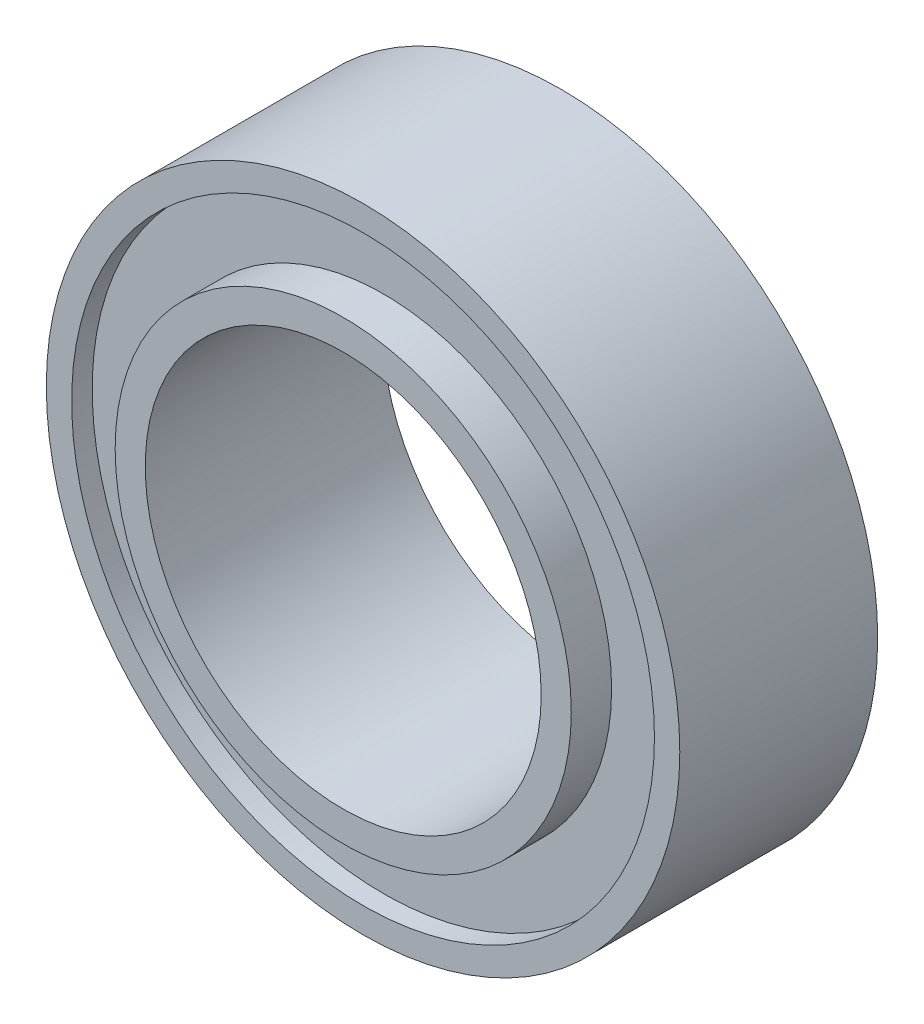
ISO-10303-21;
HEADER;
FILE_DESCRIPTION(('STEP AP214'),'2;1');
FILE_NAME('part.step','',(''),(''),'','','');
FILE_SCHEMA(('AUTOMOTIVE_DESIGN { 1 0 10303 214 1 1 1 1 }'));
ENDSEC;
DATA;
#1=APPLICATION_CONTEXT('core data for automotive mechanical design processes');
#2=APPLICATION_PROTOCOL_DEFINITION('international standard','automotive_design',2000,#1);
#3=PRODUCT_CONTEXT('',#1,'mechanical');
#4=PRODUCT('Part','Part','',(#3));
#5=PRODUCT_RELATED_PRODUCT_CATEGORY('part','',(#4));
#6=PRODUCT_DEFINITION_FORMATION('','',#4);
#7=PRODUCT_DEFINITION_CONTEXT('part definition',#1,'design');
#8=PRODUCT_DEFINITION('design','',#6,#7);
#9=PRODUCT_DEFINITION_SHAPE('','',#8);
#10=(LENGTH_UNIT() NAMED_UNIT(*) SI_UNIT(.MILLI.,.METRE.));
#11=(NAMED_UNIT(*) PLANE_ANGLE_UNIT() SI_UNIT($,.RADIAN.));
#12=(NAMED_UNIT(*) SI_UNIT($,.STERADIAN.) SOLID_ANGLE_UNIT());
#13=UNCERTAINTY_MEASURE_WITH_UNIT(LENGTH_MEASURE(1.E-05),#10,'distance_accuracy_value','');
#14=(GEOMETRIC_REPRESENTATION_CONTEXT(3) GLOBAL_UNCERTAINTY_ASSIGNED_CONTEXT((#13)) GLOBAL_UNIT_ASSIGNED_CONTEXT((#10,
#11,#12)) REPRESENTATION_CONTEXT('',''));
#15=CARTESIAN_POINT('',(0.,0.,0.));
#16=DIRECTION('',(0.,0.,1.));
#17=DIRECTION('',(1.,0.,0.));
#18=AXIS2_PLACEMENT_3D('',#15,#16,#17);
#19=CARTESIAN_POINT('',(0.,0.,3.96748));
#20=DIRECTION('',(0.,0.,-1.));
#21=DIRECTION('',(-1.,0.,0.));
#22=AXIS2_PLACEMENT_3D('',#19,#20,#21);
#23=CYLINDRICAL_SURFACE('',#22,5.842);
#24=CARTESIAN_POINT('',(0.,0.,0.));
#25=DIRECTION('',(0.,0.,1.));
#26=DIRECTION('',(1.,0.,0.));
#27=AXIS2_PLACEMENT_3D('',#24,#25,#26);
#28=CIRCLE('',#27,5.842);
#29=CARTESIAN_POINT('',(5.842,0.,0.));
#30=VERTEX_POINT('',#29);
#31=EDGE_CURVE('E54',#30,#30,#28,.T.);
#32=ORIENTED_EDGE('',*,*,#31,.F.);
#33=EDGE_LOOP('',(#32));
#34=FACE_BOUND('',#33,.T.);
#35=CARTESIAN_POINT('',(0.,0.,0.41148));
#36=DIRECTION('',(0.,0.,1.));
#37=DIRECTION('',(1.,0.,0.));
#38=AXIS2_PLACEMENT_3D('',#35,#36,#37);
#39=CIRCLE('',#38,5.842);
#40=CARTESIAN_POINT('',(5.842,0.,0.41148));
#41=VERTEX_POINT('',#40);
#42=EDGE_CURVE('E87',#41,#41,#39,.T.);
#43=ORIENTED_EDGE('',*,*,#42,.T.);
#44=EDGE_LOOP('',(#43));
#45=FACE_BOUND('',#44,.T.);
#46=ADVANCED_FACE('F34',(#34,#45),#23,.F.);
#47=CARTESIAN_POINT('',(0.,0.,3.556));
#48=DIRECTION('',(0.,0.,1.));
#49=DIRECTION('',(1.,0.,0.));
#50=AXIS2_PLACEMENT_3D('',#47,#48,#49);
#51=CIRCLE('',#50,5.842);
#52=CARTESIAN_POINT('',(5.842,0.,3.556));
#53=VERTEX_POINT('',#52);
#54=EDGE_CURVE('E10',#53,#53,#51,.T.);
#55=ORIENTED_EDGE('',*,*,#54,.F.);
#56=EDGE_LOOP('',(#55));
#57=FACE_BOUND('',#56,.T.);
#58=CARTESIAN_POINT('',(0.,0.,3.96748));
#59=DIRECTION('',(0.,0.,1.));
#60=DIRECTION('',(1.,0.,0.));
#61=AXIS2_PLACEMENT_3D('',#58,#59,#60);
#62=CIRCLE('',#61,5.842);
#63=CARTESIAN_POINT('',(5.842,0.,3.96748));
#64=VERTEX_POINT('',#63);
#65=EDGE_CURVE('E45',#64,#64,#62,.T.);
#66=ORIENTED_EDGE('',*,*,#65,.T.);
#67=EDGE_LOOP('',(#66));
#68=FACE_BOUND('',#67,.T.);
#69=ADVANCED_FACE('F36',(#57,#68),#23,.F.);
#70=CARTESIAN_POINT('',(0.,0.,3.96748));
#71=DIRECTION('',(0.,0.,-1.));
#72=DIRECTION('',(-1.,0.,0.));
#73=AXIS2_PLACEMENT_3D('',#70,#71,#72);
#74=CYLINDRICAL_SURFACE('',#73,6.35);
#75=CARTESIAN_POINT('',(0.,0.,3.96748));
#76=DIRECTION('',(0.,0.,1.));
#77=DIRECTION('',(1.,0.,0.));
#78=AXIS2_PLACEMENT_3D('',#75,#76,#77);
#79=CIRCLE('',#78,6.35);
#80=CARTESIAN_POINT('',(6.35,0.,3.96748));
#81=VERTEX_POINT('',#80);
#82=EDGE_CURVE('E41',#81,#81,#79,.T.);
#83=ORIENTED_EDGE('',*,*,#82,.F.);
#84=EDGE_LOOP('',(#83));
#85=FACE_BOUND('',#84,.T.);
#86=CARTESIAN_POINT('',(0.,0.,0.));
#87=DIRECTION('',(0.,0.,1.));
#88=DIRECTION('',(1.,0.,0.));
#89=AXIS2_PLACEMENT_3D('',#86,#87,#88);
#90=CIRCLE('',#89,6.35);
#91=CARTESIAN_POINT('',(6.35,0.,0.));
#92=VERTEX_POINT('',#91);
#93=EDGE_CURVE('E50',#92,#92,#90,.T.);
#94=ORIENTED_EDGE('',*,*,#93,.T.);
#95=EDGE_LOOP('',(#94));
#96=FACE_BOUND('',#95,.T.);
#97=ADVANCED_FACE('F60',(#85,#96),#74,.T.);
#98=CARTESIAN_POINT('',(0.,-14.1114213562373,3.96748));
#99=DIRECTION('',(0.,0.,1.));
#100=DIRECTION('',(1.,0.,0.));
#101=AXIS2_PLACEMENT_3D('',#98,#99,#100);
#102=PLANE('',#101);
#103=ORIENTED_EDGE('',*,*,#65,.F.);
#104=EDGE_LOOP('',(#103));
#105=FACE_BOUND('',#104,.T.);
#106=ORIENTED_EDGE('',*,*,#82,.T.);
#107=EDGE_LOOP('',(#106));
#108=FACE_BOUND('',#107,.T.);
#109=ADVANCED_FACE('F65',(#105,#108),#102,.T.);
#110=CARTESIAN_POINT('',(0.,-14.1114213562373,0.));
#111=DIRECTION('',(0.,0.,1.));
#112=DIRECTION('',(1.,0.,0.));
#113=AXIS2_PLACEMENT_3D('',#110,#111,#112);
#114=PLANE('',#113);
#115=ORIENTED_EDGE('',*,*,#31,.T.);
#116=EDGE_LOOP('',(#115));
#117=FACE_BOUND('',#116,.T.);
#118=ORIENTED_EDGE('',*,*,#93,.F.);
#119=EDGE_LOOP('',(#118));
#120=FACE_BOUND('',#119,.T.);
#121=ADVANCED_FACE('F62',(#117,#120),#114,.F.);
#122=CARTESIAN_POINT('',(0.,-14.1114213562373,3.556));
#123=DIRECTION('',(0.,0.,1.));
#124=DIRECTION('',(1.,0.,0.));
#125=AXIS2_PLACEMENT_3D('',#122,#123,#124);
#126=PLANE('',#125);
#127=CARTESIAN_POINT('',(0.,0.,3.556));
#128=DIRECTION('',(0.,0.,1.));
#129=DIRECTION('',(1.,0.,0.));
#130=AXIS2_PLACEMENT_3D('',#127,#128,#129);
#131=CIRCLE('',#130,4.572);
#132=CARTESIAN_POINT('',(4.572,0.,3.556));
#133=VERTEX_POINT('',#132);
#134=EDGE_CURVE('E56',#133,#133,#131,.T.);
#135=ORIENTED_EDGE('',*,*,#134,.F.);
#136=EDGE_LOOP('',(#135));
#137=FACE_BOUND('',#136,.T.);
#138=ORIENTED_EDGE('',*,*,#54,.T.);
#139=EDGE_LOOP('',(#138));
#140=FACE_BOUND('',#139,.T.);
#141=ADVANCED_FACE('F64',(#137,#140),#126,.T.);
#142=CARTESIAN_POINT('',(0.,-14.1114213562373,0.41148));
#143=DIRECTION('',(0.,0.,1.));
#144=DIRECTION('',(1.,0.,0.));
#145=AXIS2_PLACEMENT_3D('',#142,#143,#144);
#146=PLANE('',#145);
#147=CARTESIAN_POINT('',(0.,0.,0.41148));
#148=DIRECTION('',(0.,0.,1.));
#149=DIRECTION('',(1.,0.,0.));
#150=AXIS2_PLACEMENT_3D('',#147,#148,#149);
#151=CIRCLE('',#150,4.572);
#152=CARTESIAN_POINT('',(4.572,0.,0.41148));
#153=VERTEX_POINT('',#152);
#154=EDGE_CURVE('E89',#153,#153,#151,.T.);
#155=ORIENTED_EDGE('',*,*,#154,.T.);
#156=EDGE_LOOP('',(#155));
#157=FACE_BOUND('',#156,.T.);
#158=ORIENTED_EDGE('',*,*,#42,.F.);
#159=EDGE_LOOP('',(#158));
#160=FACE_BOUND('',#159,.T.);
#161=ADVANCED_FACE('F72',(#157,#160),#146,.F.);
#162=CARTESIAN_POINT('',(0.,0.,-0.39751));
#163=DIRECTION('',(0.,0.,1.));
#164=DIRECTION('',(1.,0.,0.));
#165=AXIS2_PLACEMENT_3D('',#162,#163,#164);
#166=CYLINDRICAL_SURFACE('',#165,4.572);
#167=CARTESIAN_POINT('',(0.,0.,-0.39751));
#168=DIRECTION('',(0.,0.,1.));
#169=DIRECTION('',(1.,0.,0.));
#170=AXIS2_PLACEMENT_3D('',#167,#168,#169);
#171=CIRCLE('',#170,4.572);
#172=CARTESIAN_POINT('',(4.572,0.,-0.39751));
#173=VERTEX_POINT('',#172);
#174=EDGE_CURVE('E93',#173,#173,#171,.T.);
#175=CARTESIAN_POINT('',(4.572,0.,-0.39751));
#176=CARTESIAN_POINT('',(4.572,0.,-0.389083020833333));
#177=CARTESIAN_POINT('',(4.572,0.,-0.380656041666667));
#178=CARTESIAN_POINT('',(4.572,0.,-0.363802083333333));
#179=CARTESIAN_POINT('',(4.572,0.,-0.355375104166667));
#180=CARTESIAN_POINT('',(4.572,0.,-0.338521145833333));
#181=CARTESIAN_POINT('',(4.572,0.,-0.330094166666667));
#182=CARTESIAN_POINT('',(4.572,0.,-0.313240208333333));
#183=CARTESIAN_POINT('',(4.572,0.,-0.304813229166667));
#184=CARTESIAN_POINT('',(4.572,0.,-0.287959270833333));
#185=CARTESIAN_POINT('',(4.572,0.,-0.279532291666667));
#186=CARTESIAN_POINT('',(4.572,0.,-0.262678333333333));
#187=CARTESIAN_POINT('',(4.572,0.,-0.254251354166667));
#188=CARTESIAN_POINT('',(4.572,0.,-0.237397395833333));
#189=CARTESIAN_POINT('',(4.572,0.,-0.228970416666667));
#190=CARTESIAN_POINT('',(4.572,0.,-0.212116458333333));
#191=CARTESIAN_POINT('',(4.572,0.,-0.203689479166667));
#192=CARTESIAN_POINT('',(4.572,0.,-0.186835520833333));
#193=CARTESIAN_POINT('',(4.572,0.,-0.178408541666667));
#194=CARTESIAN_POINT('',(4.572,0.,-0.161554583333333));
#195=CARTESIAN_POINT('',(4.572,0.,-0.153127604166667));
#196=CARTESIAN_POINT('',(4.572,0.,-0.136273645833333));
#197=CARTESIAN_POINT('',(4.572,0.,-0.127846666666667));
#198=CARTESIAN_POINT('',(4.572,0.,-0.110992708333333));
#199=CARTESIAN_POINT('',(4.572,0.,-0.102565729166667));
#200=CARTESIAN_POINT('',(4.572,0.,-0.0857117708333334));
#201=CARTESIAN_POINT('',(4.572,0.,-0.0772847916666667));
#202=CARTESIAN_POINT('',(4.572,0.,-0.0604308333333334));
#203=CARTESIAN_POINT('',(4.572,0.,-0.0520038541666667));
#204=CARTESIAN_POINT('',(4.572,0.,-0.0351498958333334));
#205=CARTESIAN_POINT('',(4.572,0.,-0.0267229166666667));
#206=CARTESIAN_POINT('',(4.572,0.,-0.00986895833333341));
#207=CARTESIAN_POINT('',(4.572,0.,-0.00144197916666674));
#208=CARTESIAN_POINT('',(4.572,0.,0.0154119791666666));
#209=CARTESIAN_POINT('',(4.572,0.,0.0238389583333333));
#210=CARTESIAN_POINT('',(4.572,0.,0.0406929166666666));
#211=CARTESIAN_POINT('',(4.572,0.,0.0491198958333333));
#212=CARTESIAN_POINT('',(4.572,0.,0.0659738541666666));
#213=CARTESIAN_POINT('',(4.572,0.,0.0744008333333333));
#214=CARTESIAN_POINT('',(4.572,0.,0.0912547916666666));
#215=CARTESIAN_POINT('',(4.572,0.,0.0996817708333333));
#216=CARTESIAN_POINT('',(4.572,0.,0.116535729166667));
#217=CARTESIAN_POINT('',(4.572,0.,0.124962708333333));
#218=CARTESIAN_POINT('',(4.572,0.,0.141816666666667));
#219=CARTESIAN_POINT('',(4.572,0.,0.150243645833333));
#220=CARTESIAN_POINT('',(4.572,0.,0.167097604166667));
#221=CARTESIAN_POINT('',(4.572,0.,0.175524583333333));
#222=CARTESIAN_POINT('',(4.572,0.,0.192378541666667));
#223=CARTESIAN_POINT('',(4.572,0.,0.200805520833333));
#224=CARTESIAN_POINT('',(4.572,0.,0.217659479166667));
#225=CARTESIAN_POINT('',(4.572,0.,0.226086458333333));
#226=CARTESIAN_POINT('',(4.572,0.,0.242940416666667));
#227=CARTESIAN_POINT('',(4.572,0.,0.251367395833333));
#228=CARTESIAN_POINT('',(4.572,0.,0.268221354166667));
#229=CARTESIAN_POINT('',(4.572,0.,0.276648333333333));
#230=CARTESIAN_POINT('',(4.572,0.,0.293502291666667));
#231=CARTESIAN_POINT('',(4.572,0.,0.301929270833333));
#232=CARTESIAN_POINT('',(4.572,0.,0.318783229166667));
#233=CARTESIAN_POINT('',(4.572,0.,0.327210208333333));
#234=CARTESIAN_POINT('',(4.572,0.,0.344064166666667));
#235=CARTESIAN_POINT('',(4.572,0.,0.352491145833333));
#236=CARTESIAN_POINT('',(4.572,0.,0.369345104166667));
#237=CARTESIAN_POINT('',(4.572,0.,0.377772083333333));
#238=CARTESIAN_POINT('',(4.572,0.,0.394626041666667));
#239=CARTESIAN_POINT('',(4.572,0.,0.403053020833333));
#240=CARTESIAN_POINT('',(4.572,0.,0.41148));
#241=B_SPLINE_CURVE_WITH_KNOTS('',3,(#175,#176,#177,#178,#179,#180,#181,#182,#183,#184,#185,
#186,#187,#188,#189,#190,#191,#192,#193,#194,#195,#196,#197,#198,#199,#200,#201,#202,#203,#204,
#205,#206,#207,#208,#209,#210,#211,#212,#213,#214,#215,#216,#217,#218,#219,#220,#221,#222,#223,
#224,#225,#226,#227,#228,#229,#230,#231,#232,#233,#234,#235,#236,#237,#238,#239,#240),
.UNSPECIFIED.,.F.,.F.,(4,2,2,2,2,2,2,2,2,2,2,2,2,2,2,2,2,2,2,2,2,2,2,2,2,2,2,2,2,2,2,2,4),(0.,
0.0252809375,0.050561875,0.0758428125,0.10112375,0.1264046875,0.151685625,0.1769665625,
0.2022475,0.2275284375,0.252809375,0.2780903125,0.30337125,0.3286521875,0.353933125,
0.3792140625,0.404495,0.4297759375,0.455056875,0.4803378125,0.50561875,0.5308996875,0.556180625,
0.5814615625,0.6067425,0.6320234375,0.657304375,0.6825853125,0.70786625,0.7331471875,
0.758428125,0.7837090625,0.80899),.UNSPECIFIED.);
#242=EDGE_CURVE('BSEAM121',#173,#153,#241,.T.);
#243=ORIENTED_EDGE('',*,*,#174,.T.);
#244=ORIENTED_EDGE('',*,*,#154,.F.);
#245=ORIENTED_EDGE('',*,*,#242,.T.);
#246=ORIENTED_EDGE('',*,*,#242,.F.);
#247=EDGE_LOOP('',(#243,#245,#244,#246));
#248=FACE_BOUND('',#247,.T.);
#249=ADVANCED_FACE('F121',(#248),#166,.T.);
#250=CARTESIAN_POINT('',(0.,0.,-0.39751));
#251=DIRECTION('',(0.,0.,1.));
#252=DIRECTION('',(1.,0.,0.));
#253=AXIS2_PLACEMENT_3D('',#250,#251,#252);
#254=CYLINDRICAL_SURFACE('',#253,3.96875);
#255=CARTESIAN_POINT('',(0.,0.,-0.39751));
#256=DIRECTION('',(0.,0.,1.));
#257=DIRECTION('',(1.,0.,0.));
#258=AXIS2_PLACEMENT_3D('',#255,#256,#257);
#259=CIRCLE('',#258,3.96875);
#260=CARTESIAN_POINT('',(3.96875,0.,-0.39751));
#261=VERTEX_POINT('',#260);
#262=EDGE_CURVE('E98',#261,#261,#259,.T.);
#263=CARTESIAN_POINT('',(0.,0.,4.36499));
#264=DIRECTION('',(0.,0.,1.));
#265=DIRECTION('',(1.,0.,0.));
#266=AXIS2_PLACEMENT_3D('',#263,#264,#265);
#267=CIRCLE('',#266,3.96875);
#268=CARTESIAN_POINT('',(3.96875,0.,4.36499));
#269=VERTEX_POINT('',#268);
#270=EDGE_CURVE('E104',#269,#269,#267,.T.);
#271=CARTESIAN_POINT('',(3.96875,0.,-0.39751));
#272=CARTESIAN_POINT('',(3.96875,0.,-0.347900625));
#273=CARTESIAN_POINT('',(3.96875,0.,-0.29829125));
#274=CARTESIAN_POINT('',(3.96875,0.,-0.1990725));
#275=CARTESIAN_POINT('',(3.96875,0.,-0.149463125));
#276=CARTESIAN_POINT('',(3.96875,0.,-0.050244375));
#277=CARTESIAN_POINT('',(3.96875,0.,-0.000634999999999963));
#278=CARTESIAN_POINT('',(3.96875,0.,0.09858375));
#279=CARTESIAN_POINT('',(3.96875,0.,0.148193125));
#280=CARTESIAN_POINT('',(3.96875,0.,0.247411875));
#281=CARTESIAN_POINT('',(3.96875,0.,0.29702125));
#282=CARTESIAN_POINT('',(3.96875,0.,0.39624));
#283=CARTESIAN_POINT('',(3.96875,0.,0.445849375));
#284=CARTESIAN_POINT('',(3.96875,0.,0.545068125));
#285=CARTESIAN_POINT('',(3.96875,0.,0.5946775));
#286=CARTESIAN_POINT('',(3.96875,0.,0.69389625));
#287=CARTESIAN_POINT('',(3.96875,0.,0.743505625));
#288=CARTESIAN_POINT('',(3.96875,0.,0.842724375));
#289=CARTESIAN_POINT('',(3.96875,0.,0.89233375));
#290=CARTESIAN_POINT('',(3.96875,0.,0.9915525));
#291=CARTESIAN_POINT('',(3.96875,0.,1.041161875));
#292=CARTESIAN_POINT('',(3.96875,0.,1.140380625));
#293=CARTESIAN_POINT('',(3.96875,0.,1.18999));
#294=CARTESIAN_POINT('',(3.96875,0.,1.28920875));
#295=CARTESIAN_POINT('',(3.96875,0.,1.338818125));
#296=CARTESIAN_POINT('',(3.96875,0.,1.438036875));
#297=CARTESIAN_POINT('',(3.96875,0.,1.48764625));
#298=CARTESIAN_POINT('',(3.96875,0.,1.586865));
#299=CARTESIAN_POINT('',(3.96875,0.,1.636474375));
#300=CARTESIAN_POINT('',(3.96875,0.,1.735693125));
#301=CARTESIAN_POINT('',(3.96875,0.,1.7853025));
#302=CARTESIAN_POINT('',(3.96875,0.,1.88452125));
#303=CARTESIAN_POINT('',(3.96875,0.,1.934130625));
#304=CARTESIAN_POINT('',(3.96875,0.,2.033349375));
#305=CARTESIAN_POINT('',(3.96875,0.,2.08295875));
#306=CARTESIAN_POINT('',(3.96875,0.,2.1821775));
#307=CARTESIAN_POINT('',(3.96875,0.,2.231786875));
#308=CARTESIAN_POINT('',(3.96875,0.,2.331005625));
#309=CARTESIAN_POINT('',(3.96875,0.,2.380615));
#310=CARTESIAN_POINT('',(3.96875,0.,2.47983375));
#311=CARTESIAN_POINT('',(3.96875,0.,2.529443125));
#312=CARTESIAN_POINT('',(3.96875,0.,2.628661875));
#313=CARTESIAN_POINT('',(3.96875,0.,2.67827125));
#314=CARTESIAN_POINT('',(3.96875,0.,2.77749));
#315=CARTESIAN_POINT('',(3.96875,0.,2.827099375));
#316=CARTESIAN_POINT('',(3.96875,0.,2.926318125));
#317=CARTESIAN_POINT('',(3.96875,0.,2.9759275));
#318=CARTESIAN_POINT('',(3.96875,0.,3.07514625));
#319=CARTESIAN_POINT('',(3.96875,0.,3.124755625));
#320=CARTESIAN_POINT('',(3.96875,0.,3.223974375));
#321=CARTESIAN_POINT('',(3.96875,0.,3.27358375));
#322=CARTESIAN_POINT('',(3.96875,0.,3.3728025));
#323=CARTESIAN_POINT('',(3.96875,0.,3.422411875));
#324=CARTESIAN_POINT('',(3.96875,0.,3.521630625));
#325=CARTESIAN_POINT('',(3.96875,0.,3.57124));
#326=CARTESIAN_POINT('',(3.96875,0.,3.67045875));
#327=CARTESIAN_POINT('',(3.96875,0.,3.720068125));
#328=CARTESIAN_POINT('',(3.96875,0.,3.819286875));
#329=CARTESIAN_POINT('',(3.96875,0.,3.86889625));
#330=CARTESIAN_POINT('',(3.96875,0.,3.968115));
#331=CARTESIAN_POINT('',(3.96875,0.,4.017724375));
#332=CARTESIAN_POINT('',(3.96875,0.,4.116943125));
#333=CARTESIAN_POINT('',(3.96875,0.,4.1665525));
#334=CARTESIAN_POINT('',(3.96875,0.,4.26577125));
#335=CARTESIAN_POINT('',(3.96875,0.,4.315380625));
#336=CARTESIAN_POINT('',(3.96875,0.,4.36499));
#337=B_SPLINE_CURVE_WITH_KNOTS('',3,(#271,#272,#273,#274,#275,#276,#277,#278,#279,#280,#281,
#282,#283,#284,#285,#286,#287,#288,#289,#290,#291,#292,#293,#294,#295,#296,#297,#298,#299,#300,
#301,#302,#303,#304,#305,#306,#307,#308,#309,#310,#311,#312,#313,#314,#315,#316,#317,#318,#319,
#320,#321,#322,#323,#324,#325,#326,#327,#328,#329,#330,#331,#332,#333,#334,#335,#336),
.UNSPECIFIED.,.F.,.F.,(4,2,2,2,2,2,2,2,2,2,2,2,2,2,2,2,2,2,2,2,2,2,2,2,2,2,2,2,2,2,2,2,4),(0.,
0.148828125,0.29765625,0.446484375,0.5953125,0.744140625,0.89296875,1.041796875,1.190625,
1.339453125,1.48828125,1.637109375,1.7859375,1.934765625,2.08359375,2.232421875,2.38125,
2.530078125,2.67890625,2.827734375,2.9765625,3.125390625,3.27421875,3.423046875,3.571875,
3.720703125,3.86953125,4.018359375,4.1671875,4.316015625,4.46484375,4.613671875,4.7625),.UNSPECIFIED.);
#338=EDGE_CURVE('BSEAM108',#261,#269,#337,.T.);
#339=ORIENTED_EDGE('',*,*,#262,.F.);
#340=ORIENTED_EDGE('',*,*,#270,.T.);
#341=ORIENTED_EDGE('',*,*,#338,.T.);
#342=ORIENTED_EDGE('',*,*,#338,.F.);
#343=EDGE_LOOP('',(#339,#341,#340,#342));
#344=FACE_BOUND('',#343,.T.);
#345=ADVANCED_FACE('F108',(#344),#254,.F.);
#346=CARTESIAN_POINT('',(0.,0.,4.36499));
#347=DIRECTION('',(0.,0.,1.));
#348=DIRECTION('',(1.,0.,0.));
#349=AXIS2_PLACEMENT_3D('',#346,#347,#348);
#350=CIRCLE('',#349,4.572);
#351=CARTESIAN_POINT('',(4.572,0.,4.36499));
#352=VERTEX_POINT('',#351);
#353=EDGE_CURVE('E101',#352,#352,#350,.T.);
#354=CARTESIAN_POINT('',(4.572,0.,3.556));
#355=CARTESIAN_POINT('',(4.572,0.,3.56442697916667));
#356=CARTESIAN_POINT('',(4.572,0.,3.57285395833333));
#357=CARTESIAN_POINT('',(4.572,0.,3.58970791666667));
#358=CARTESIAN_POINT('',(4.572,0.,3.59813489583333));
#359=CARTESIAN_POINT('',(4.572,0.,3.61498885416667));
#360=CARTESIAN_POINT('',(4.572,0.,3.62341583333333));
#361=CARTESIAN_POINT('',(4.572,0.,3.64026979166667));
#362=CARTESIAN_POINT('',(4.572,0.,3.64869677083333));
#363=CARTESIAN_POINT('',(4.572,0.,3.66555072916667));
#364=CARTESIAN_POINT('',(4.572,0.,3.67397770833333));
#365=CARTESIAN_POINT('',(4.572,0.,3.69083166666667));
#366=CARTESIAN_POINT('',(4.572,0.,3.69925864583333));
#367=CARTESIAN_POINT('',(4.572,0.,3.71611260416667));
#368=CARTESIAN_POINT('',(4.572,0.,3.72453958333333));
#369=CARTESIAN_POINT('',(4.572,0.,3.74139354166667));
#370=CARTESIAN_POINT('',(4.572,0.,3.74982052083333));
#371=CARTESIAN_POINT('',(4.572,0.,3.76667447916667));
#372=CARTESIAN_POINT('',(4.572,0.,3.77510145833333));
#373=CARTESIAN_POINT('',(4.572,0.,3.79195541666667));
#374=CARTESIAN_POINT('',(4.572,0.,3.80038239583333));
#375=CARTESIAN_POINT('',(4.572,0.,3.81723635416667));
#376=CARTESIAN_POINT('',(4.572,0.,3.82566333333333));
#377=CARTESIAN_POINT('',(4.572,0.,3.84251729166667));
#378=CARTESIAN_POINT('',(4.572,0.,3.85094427083333));
#379=CARTESIAN_POINT('',(4.572,0.,3.86779822916667));
#380=CARTESIAN_POINT('',(4.572,0.,3.87622520833333));
#381=CARTESIAN_POINT('',(4.572,0.,3.89307916666667));
#382=CARTESIAN_POINT('',(4.572,0.,3.90150614583333));
#383=CARTESIAN_POINT('',(4.572,0.,3.91836010416667));
#384=CARTESIAN_POINT('',(4.572,0.,3.92678708333333));
#385=CARTESIAN_POINT('',(4.572,0.,3.94364104166667));
#386=CARTESIAN_POINT('',(4.572,0.,3.95206802083333));
#387=CARTESIAN_POINT('',(4.572,0.,3.96892197916667));
#388=CARTESIAN_POINT('',(4.572,0.,3.97734895833333));
#389=CARTESIAN_POINT('',(4.572,0.,3.99420291666667));
#390=CARTESIAN_POINT('',(4.572,0.,4.00262989583333));
#391=CARTESIAN_POINT('',(4.572,0.,4.01948385416667));
#392=CARTESIAN_POINT('',(4.572,0.,4.02791083333333));
#393=CARTESIAN_POINT('',(4.572,0.,4.04476479166667));
#394=CARTESIAN_POINT('',(4.572,0.,4.05319177083333));
#395=CARTESIAN_POINT('',(4.572,0.,4.07004572916667));
#396=CARTESIAN_POINT('',(4.572,0.,4.07847270833333));
#397=CARTESIAN_POINT('',(4.572,0.,4.09532666666667));
#398=CARTESIAN_POINT('',(4.572,0.,4.10375364583333));
#399=CARTESIAN_POINT('',(4.572,0.,4.12060760416667));
#400=CARTESIAN_POINT('',(4.572,0.,4.12903458333333));
#401=CARTESIAN_POINT('',(4.572,0.,4.14588854166667));
#402=CARTESIAN_POINT('',(4.572,0.,4.15431552083333));
#403=CARTESIAN_POINT('',(4.572,0.,4.17116947916667));
#404=CARTESIAN_POINT('',(4.572,0.,4.17959645833333));
#405=CARTESIAN_POINT('',(4.572,0.,4.19645041666667));
#406=CARTESIAN_POINT('',(4.572,0.,4.20487739583333));
#407=CARTESIAN_POINT('',(4.572,0.,4.22173135416667));
#408=CARTESIAN_POINT('',(4.572,0.,4.23015833333333));
#409=CARTESIAN_POINT('',(4.572,0.,4.24701229166667));
#410=CARTESIAN_POINT('',(4.572,0.,4.25543927083333));
#411=CARTESIAN_POINT('',(4.572,0.,4.27229322916667));
#412=CARTESIAN_POINT('',(4.572,0.,4.28072020833333));
#413=CARTESIAN_POINT('',(4.572,0.,4.29757416666667));
#414=CARTESIAN_POINT('',(4.572,0.,4.30600114583333));
#415=CARTESIAN_POINT('',(4.572,0.,4.32285510416667));
#416=CARTESIAN_POINT('',(4.572,0.,4.33128208333333));
#417=CARTESIAN_POINT('',(4.572,0.,4.34813604166667));
#418=CARTESIAN_POINT('',(4.572,0.,4.35656302083333));
#419=CARTESIAN_POINT('',(4.572,0.,4.36499));
#420=B_SPLINE_CURVE_WITH_KNOTS('',3,(#354,#355,#356,#357,#358,#359,#360,#361,#362,#363,#364,
#365,#366,#367,#368,#369,#370,#371,#372,#373,#374,#375,#376,#377,#378,#379,#380,#381,#382,#383,
#384,#385,#386,#387,#388,#389,#390,#391,#392,#393,#394,#395,#396,#397,#398,#399,#400,#401,#402,
#403,#404,#405,#406,#407,#408,#409,#410,#411,#412,#413,#414,#415,#416,#417,#418,#419),
.UNSPECIFIED.,.F.,.F.,(4,2,2,2,2,2,2,2,2,2,2,2,2,2,2,2,2,2,2,2,2,2,2,2,2,2,2,2,2,2,2,2,4),(0.,
0.0252809375000003,0.0505618749999997,0.0758428125,0.10112375,0.1264046875,0.151685625,
0.1769665625,0.202247500000001,0.2275284375,0.252809375,0.278090312500001,0.30337125,
0.3286521875,0.353933125000001,0.3792140625,0.404495,0.429775937500001,0.455056875,0.4803378125,
0.505618750000001,0.530899687500001,0.556180625,0.581461562500001,0.6067425,0.6320234375,
0.657304375000001,0.682585312500001,0.70786625,0.733147187500001,0.758428125000001,0.7837090625,
0.808990000000001),.UNSPECIFIED.);
#421=EDGE_CURVE('BSEAM117',#133,#352,#420,.T.);
#422=ORIENTED_EDGE('',*,*,#134,.T.);
#423=ORIENTED_EDGE('',*,*,#353,.F.);
#424=ORIENTED_EDGE('',*,*,#421,.T.);
#425=ORIENTED_EDGE('',*,*,#421,.F.);
#426=EDGE_LOOP('',(#422,#424,#423,#425));
#427=FACE_BOUND('',#426,.T.);
#428=ADVANCED_FACE('F117',(#427),#166,.T.);
#429=CARTESIAN_POINT('',(0.,-14.1114213562373,-0.39751));
#430=DIRECTION('',(0.,0.,1.));
#431=DIRECTION('',(1.,0.,0.));
#432=AXIS2_PLACEMENT_3D('',#429,#430,#431);
#433=PLANE('',#432);
#434=ORIENTED_EDGE('',*,*,#262,.T.);
#435=EDGE_LOOP('',(#434));
#436=FACE_BOUND('',#435,.T.);
#437=ORIENTED_EDGE('',*,*,#174,.F.);
#438=EDGE_LOOP('',(#437));
#439=FACE_BOUND('',#438,.T.);
#440=ADVANCED_FACE('F113',(#436,#439),#433,.F.);
#441=CARTESIAN_POINT('',(0.,-14.1114213562373,4.36499));
#442=DIRECTION('',(0.,0.,1.));
#443=DIRECTION('',(1.,0.,0.));
#444=AXIS2_PLACEMENT_3D('',#441,#442,#443);
#445=PLANE('',#444);
#446=ORIENTED_EDGE('',*,*,#270,.F.);
#447=EDGE_LOOP('',(#446));
#448=FACE_BOUND('',#447,.T.);
#449=ORIENTED_EDGE('',*,*,#353,.T.);
#450=EDGE_LOOP('',(#449));
#451=FACE_BOUND('',#450,.T.);
#452=ADVANCED_FACE('F110',(#448,#451),#445,.T.);
#453=CLOSED_SHELL('',(#46,#69,#97,#109,#121,#141,#161,#249,#345,#428,#440,#452));
#454=MANIFOLD_SOLID_BREP('B2',#453);
#455=ADVANCED_BREP_SHAPE_REPRESENTATION('',(#18,#454),#14);
#456=SHAPE_DEFINITION_REPRESENTATION(#9,#455);
ENDSEC;
END-ISO-10303-21;
